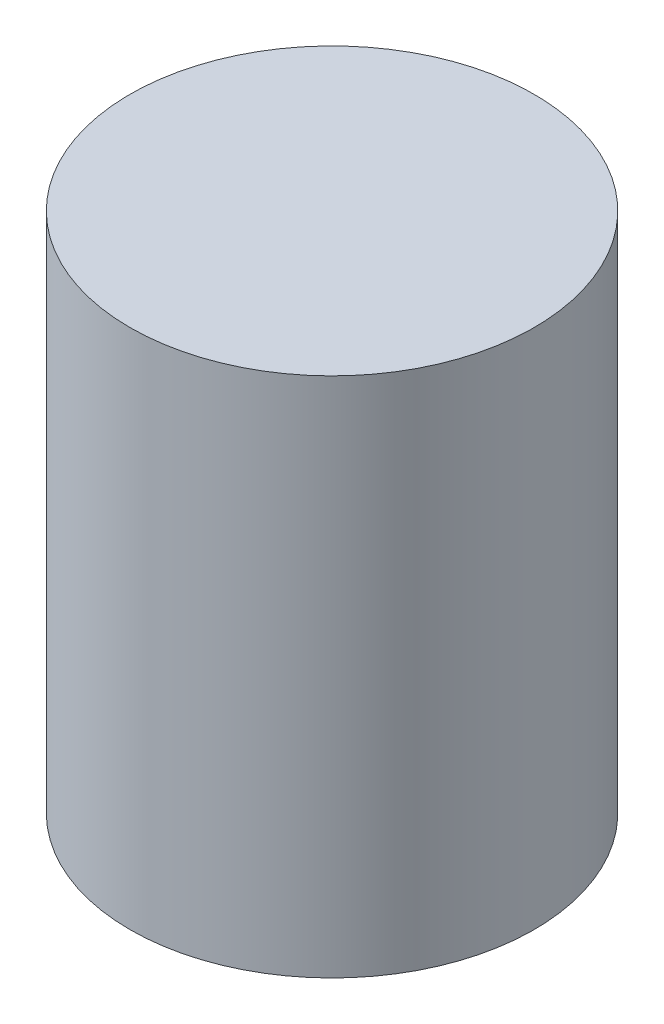
ISO-10303-21;
HEADER;
FILE_DESCRIPTION(('STEP AP214'),'2;1');
FILE_NAME('part.step','',(''),(''),'','','');
FILE_SCHEMA(('AUTOMOTIVE_DESIGN { 1 0 10303 214 1 1 1 1 }'));
ENDSEC;
DATA;
#1=APPLICATION_CONTEXT('core data for automotive mechanical design processes');
#2=APPLICATION_PROTOCOL_DEFINITION('international standard','automotive_design',2000,#1);
#3=PRODUCT_CONTEXT('',#1,'mechanical');
#4=PRODUCT('Part','Part','',(#3));
#5=PRODUCT_RELATED_PRODUCT_CATEGORY('part','',(#4));
#6=PRODUCT_DEFINITION_FORMATION('','',#4);
#7=PRODUCT_DEFINITION_CONTEXT('part definition',#1,'design');
#8=PRODUCT_DEFINITION('design','',#6,#7);
#9=PRODUCT_DEFINITION_SHAPE('','',#8);
#10=(LENGTH_UNIT() NAMED_UNIT(*) SI_UNIT(.MILLI.,.METRE.));
#11=(NAMED_UNIT(*) PLANE_ANGLE_UNIT() SI_UNIT($,.RADIAN.));
#12=(NAMED_UNIT(*) SI_UNIT($,.STERADIAN.) SOLID_ANGLE_UNIT());
#13=UNCERTAINTY_MEASURE_WITH_UNIT(LENGTH_MEASURE(1.E-05),#10,'distance_accuracy_value','');
#14=(GEOMETRIC_REPRESENTATION_CONTEXT(3) GLOBAL_UNCERTAINTY_ASSIGNED_CONTEXT((#13)) GLOBAL_UNIT_ASSIGNED_CONTEXT((#10,
#11,#12)) REPRESENTATION_CONTEXT('',''));
#15=CARTESIAN_POINT('',(0.,0.,0.));
#16=DIRECTION('',(0.,0.,1.));
#17=DIRECTION('',(1.,0.,0.));
#18=AXIS2_PLACEMENT_3D('',#15,#16,#17);
#19=CARTESIAN_POINT('',(0.,8.,0.));
#20=DIRECTION('',(0.,-1.,0.));
#21=DIRECTION('',(0.,0.,-1.));
#22=AXIS2_PLACEMENT_3D('',#19,#20,#21);
#23=CYLINDRICAL_SURFACE('',#22,3.1);
#24=CARTESIAN_POINT('',(0.,8.,0.));
#25=DIRECTION('',(0.,1.,0.));
#26=DIRECTION('',(0.,0.,1.));
#27=AXIS2_PLACEMENT_3D('',#24,#25,#26);
#28=CIRCLE('',#27,3.1);
#29=CARTESIAN_POINT('',(0.,8.,3.1));
#30=VERTEX_POINT('',#29);
#31=EDGE_CURVE('E11',#30,#30,#28,.T.);
#32=ORIENTED_EDGE('',*,*,#31,.F.);
#33=EDGE_LOOP('',(#32));
#34=FACE_BOUND('',#33,.T.);
#35=CARTESIAN_POINT('',(0.,0.,0.));
#36=DIRECTION('',(0.,1.,0.));
#37=DIRECTION('',(0.,0.,1.));
#38=AXIS2_PLACEMENT_3D('',#35,#36,#37);
#39=CIRCLE('',#38,3.1);
#40=CARTESIAN_POINT('',(0.,0.,3.1));
#41=VERTEX_POINT('',#40);
#42=EDGE_CURVE('E38',#41,#41,#39,.T.);
#43=ORIENTED_EDGE('',*,*,#42,.T.);
#44=EDGE_LOOP('',(#43));
#45=FACE_BOUND('',#44,.T.);
#46=ADVANCED_FACE('F35',(#34,#45),#23,.T.);
#47=CARTESIAN_POINT('',(0.,8.,0.));
#48=DIRECTION('',(0.,1.,0.));
#49=DIRECTION('',(0.,0.,1.));
#50=AXIS2_PLACEMENT_3D('',#47,#48,#49);
#51=PLANE('',#50);
#52=ORIENTED_EDGE('',*,*,#31,.T.);
#53=EDGE_LOOP('',(#52));
#54=FACE_BOUND('',#53,.T.);
#55=ADVANCED_FACE('F69',(#54),#51,.T.);
#56=CARTESIAN_POINT('',(0.,0.,0.));
#57=DIRECTION('',(0.,1.,0.));
#58=DIRECTION('',(0.,0.,1.));
#59=AXIS2_PLACEMENT_3D('',#56,#57,#58);
#60=PLANE('',#59);
#61=CARTESIAN_POINT('',(0.,0.,0.));
#62=DIRECTION('',(0.,1.,0.));
#63=DIRECTION('',(0.,0.,1.));
#64=AXIS2_PLACEMENT_3D('',#61,#62,#63);
#65=CIRCLE('',#64,1.975);
#66=CARTESIAN_POINT('',(0.,0.,1.975));
#67=VERTEX_POINT('',#66);
#68=EDGE_CURVE('E49',#67,#67,#65,.T.);
#69=ORIENTED_EDGE('',*,*,#68,.T.);
#70=EDGE_LOOP('',(#69));
#71=FACE_BOUND('',#70,.T.);
#72=ORIENTED_EDGE('',*,*,#42,.F.);
#73=EDGE_LOOP('',(#72));
#74=FACE_BOUND('',#73,.T.);
#75=ADVANCED_FACE('F53',(#71,#74),#60,.F.);
#76=CARTESIAN_POINT('',(0.,13.5861435713737,0.));
#77=DIRECTION('',(0.,-1.,0.));
#78=DIRECTION('',(0.,0.,-1.));
#79=AXIS2_PLACEMENT_3D('',#76,#77,#78);
#80=CYLINDRICAL_SURFACE('',#79,1.975);
#81=ORIENTED_EDGE('',*,*,#68,.F.);
#82=EDGE_LOOP('',(#81));
#83=FACE_BOUND('',#82,.T.);
#84=CARTESIAN_POINT('',(0.,6.,0.));
#85=DIRECTION('',(0.,1.,0.));
#86=DIRECTION('',(0.,0.,1.));
#87=AXIS2_PLACEMENT_3D('',#84,#85,#86);
#88=CIRCLE('',#87,1.975);
#89=CARTESIAN_POINT('',(0.,6.,1.975));
#90=VERTEX_POINT('',#89);
#91=EDGE_CURVE('E45',#90,#90,#88,.T.);
#92=ORIENTED_EDGE('',*,*,#91,.T.);
#93=EDGE_LOOP('',(#92));
#94=FACE_BOUND('',#93,.T.);
#95=ADVANCED_FACE('F56',(#83,#94),#80,.F.);
#96=CARTESIAN_POINT('',(0.,6.,0.));
#97=DIRECTION('',(0.,1.,0.));
#98=DIRECTION('',(0.,0.,1.));
#99=AXIS2_PLACEMENT_3D('',#96,#97,#98);
#100=PLANE('',#99);
#101=ORIENTED_EDGE('',*,*,#91,.F.);
#102=EDGE_LOOP('',(#101));
#103=FACE_BOUND('',#102,.T.);
#104=ADVANCED_FACE('F59',(#103),#100,.F.);
#105=CLOSED_SHELL('',(#46,#55,#75,#95,#104));
#106=MANIFOLD_SOLID_BREP('B2',#105);
#107=ADVANCED_BREP_SHAPE_REPRESENTATION('',(#18,#106),#14);
#108=SHAPE_DEFINITION_REPRESENTATION(#9,#107);
ENDSEC;
END-ISO-10303-21;
